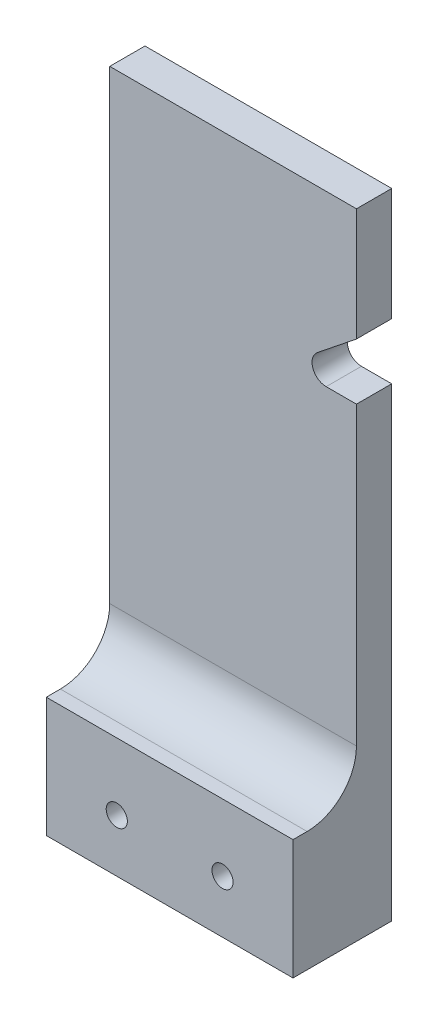
ISO-10303-21;
HEADER;
FILE_DESCRIPTION(('STEP AP214'),'2;1');
FILE_NAME('part.step','',(''),(''),'','','');
FILE_SCHEMA(('AUTOMOTIVE_DESIGN { 1 0 10303 214 1 1 1 1 }'));
ENDSEC;
DATA;
#1=APPLICATION_CONTEXT('core data for automotive mechanical design processes');
#2=APPLICATION_PROTOCOL_DEFINITION('international standard','automotive_design',2000,#1);
#3=PRODUCT_CONTEXT('',#1,'mechanical');
#4=PRODUCT('Part','Part','',(#3));
#5=PRODUCT_RELATED_PRODUCT_CATEGORY('part','',(#4));
#6=PRODUCT_DEFINITION_FORMATION('','',#4);
#7=PRODUCT_DEFINITION_CONTEXT('part definition',#1,'design');
#8=PRODUCT_DEFINITION('design','',#6,#7);
#9=PRODUCT_DEFINITION_SHAPE('','',#8);
#10=(LENGTH_UNIT() NAMED_UNIT(*) SI_UNIT(.MILLI.,.METRE.));
#11=(NAMED_UNIT(*) PLANE_ANGLE_UNIT() SI_UNIT($,.RADIAN.));
#12=(NAMED_UNIT(*) SI_UNIT($,.STERADIAN.) SOLID_ANGLE_UNIT());
#13=UNCERTAINTY_MEASURE_WITH_UNIT(LENGTH_MEASURE(1.E-05),#10,'distance_accuracy_value','');
#14=(GEOMETRIC_REPRESENTATION_CONTEXT(3) GLOBAL_UNCERTAINTY_ASSIGNED_CONTEXT((#13)) GLOBAL_UNIT_ASSIGNED_CONTEXT((#10,
#11,#12)) REPRESENTATION_CONTEXT('',''));
#15=CARTESIAN_POINT('',(0.,0.,0.));
#16=DIRECTION('',(0.,0.,1.));
#17=DIRECTION('',(1.,0.,0.));
#18=AXIS2_PLACEMENT_3D('',#15,#16,#17);
#19=CARTESIAN_POINT('',(17.5,-45.,5.));
#20=DIRECTION('',(-1.,0.,0.));
#21=DIRECTION('',(0.,0.,1.));
#22=AXIS2_PLACEMENT_3D('',#19,#20,#21);
#23=PLANE('',#22);
#24=DIRECTION('',(0.,1.,0.));
#25=VECTOR('',#24,1.);
#26=CARTESIAN_POINT('',(17.5,-45.,5.));
#27=LINE('',#26,#25);
#28=CARTESIAN_POINT('',(17.5,29.,5.));
#29=VERTEX_POINT('',#28);
#30=CARTESIAN_POINT('',(17.5,45.,5.));
#31=VERTEX_POINT('',#30);
#32=EDGE_CURVE('E138',#29,#31,#27,.T.);
#33=ORIENTED_EDGE('',*,*,#32,.F.);
#34=DIRECTION('',(0.,0.,-1.));
#35=VECTOR('',#34,1.);
#36=CARTESIAN_POINT('',(17.5,29.,14.));
#37=LINE('',#36,#35);
#38=CARTESIAN_POINT('',(17.5,29.,0.));
#39=VERTEX_POINT('',#38);
#40=EDGE_CURVE('E127',#29,#39,#37,.T.);
#41=ORIENTED_EDGE('',*,*,#40,.T.);
#42=DIRECTION('',(0.,1.,0.));
#43=VECTOR('',#42,1.);
#44=CARTESIAN_POINT('',(17.5,-45.,0.));
#45=LINE('',#44,#43);
#46=CARTESIAN_POINT('',(17.5,45.,0.));
#47=VERTEX_POINT('',#46);
#48=EDGE_CURVE('E136',#39,#47,#45,.T.);
#49=ORIENTED_EDGE('',*,*,#48,.T.);
#50=DIRECTION('',(0.,0.,-1.));
#51=VECTOR('',#50,1.);
#52=CARTESIAN_POINT('',(17.5,45.,5.));
#53=LINE('',#52,#51);
#54=EDGE_CURVE('E171',#31,#47,#53,.T.);
#55=ORIENTED_EDGE('',*,*,#54,.F.);
#56=EDGE_LOOP('',(#33,#41,#49,#55));
#57=FACE_BOUND('',#56,.T.);
#58=ADVANCED_FACE('F41',(#57),#23,.F.);
#59=CARTESIAN_POINT('',(0.,0.,5.));
#60=DIRECTION('',(0.,0.,-1.));
#61=DIRECTION('',(-1.,0.,0.));
#62=AXIS2_PLACEMENT_3D('',#59,#60,#61);
#63=PLANE('',#62);
#64=DIRECTION('',(-1.,0.,0.));
#65=VECTOR('',#64,1.);
#66=CARTESIAN_POINT('',(0.,21.,5.));
#67=LINE('',#66,#65);
#68=CARTESIAN_POINT('',(17.5,21.,5.));
#69=VERTEX_POINT('',#68);
#70=CARTESIAN_POINT('',(13.2015621187164,21.,5.));
#71=VERTEX_POINT('',#70);
#72=EDGE_CURVE('E238',#69,#71,#67,.T.);
#73=ORIENTED_EDGE('',*,*,#72,.T.);
#74=CARTESIAN_POINT('',(13.2015621187164,23.,5.));
#75=DIRECTION('',(0.,0.,-1.));
#76=DIRECTION('',(-1.,0.,0.));
#77=AXIS2_PLACEMENT_3D('',#74,#75,#76);
#78=CIRCLE('',#77,2.);
#79=CARTESIAN_POINT('',(11.9521720236076,24.561737618886,5.));
#80=VERTEX_POINT('',#79);
#81=EDGE_CURVE('E11',#71,#80,#78,.T.);
#82=ORIENTED_EDGE('',*,*,#81,.T.);
#83=DIRECTION('',(0.78086880944303,0.624695047554424,0.));
#84=VECTOR('',#83,1.);
#85=CARTESIAN_POINT('',(-7.3170731707317,9.14634146341463,5.));
#86=LINE('',#85,#84);
#87=EDGE_CURVE('E229',#80,#29,#86,.T.);
#88=ORIENTED_EDGE('',*,*,#87,.T.);
#89=ORIENTED_EDGE('',*,*,#32,.T.);
#90=DIRECTION('',(-1.,0.,0.));
#91=VECTOR('',#90,1.);
#92=CARTESIAN_POINT('',(-17.5,45.,5.));
#93=LINE('',#92,#91);
#94=CARTESIAN_POINT('',(-17.5,45.,5.));
#95=VERTEX_POINT('',#94);
#96=EDGE_CURVE('E210',#31,#95,#93,.T.);
#97=ORIENTED_EDGE('',*,*,#96,.T.);
#98=DIRECTION('',(0.,-1.,0.));
#99=VECTOR('',#98,1.);
#100=CARTESIAN_POINT('',(-17.5,-45.,5.));
#101=LINE('',#100,#99);
#102=CARTESIAN_POINT('',(-17.5,-21.,5.));
#103=VERTEX_POINT('',#102);
#104=EDGE_CURVE('E155',#95,#103,#101,.T.);
#105=ORIENTED_EDGE('',*,*,#104,.T.);
#106=DIRECTION('',(-1.,0.,0.));
#107=VECTOR('',#106,1.);
#108=CARTESIAN_POINT('',(17.5,-21.,5.));
#109=LINE('',#108,#107);
#110=CARTESIAN_POINT('',(17.5,-21.,5.));
#111=VERTEX_POINT('',#110);
#112=EDGE_CURVE('E176',#103,#111,#109,.F.);
#113=ORIENTED_EDGE('',*,*,#112,.T.);
#114=EDGE_CURVE('E192',#111,#69,#27,.T.);
#115=ORIENTED_EDGE('',*,*,#114,.T.);
#116=EDGE_LOOP('',(#73,#82,#88,#89,#97,#105,#113,#115));
#117=FACE_BOUND('',#116,.T.);
#118=ADVANCED_FACE('F208',(#117),#63,.F.);
#119=CARTESIAN_POINT('',(17.5,-45.,0.));
#120=VERTEX_POINT('',#119);
#121=CARTESIAN_POINT('',(17.5,21.,0.));
#122=VERTEX_POINT('',#121);
#123=EDGE_CURVE('E146',#120,#122,#45,.T.);
#124=ORIENTED_EDGE('',*,*,#123,.T.);
#125=DIRECTION('',(0.,0.,-1.));
#126=VECTOR('',#125,1.);
#127=CARTESIAN_POINT('',(17.5,21.,14.));
#128=LINE('',#127,#126);
#129=EDGE_CURVE('E139',#69,#122,#128,.T.);
#130=ORIENTED_EDGE('',*,*,#129,.F.);
#131=ORIENTED_EDGE('',*,*,#114,.F.);
#132=CARTESIAN_POINT('',(17.5,-21.,12.));
#133=DIRECTION('',(-1.,0.,0.));
#134=DIRECTION('',(0.,0.,1.));
#135=AXIS2_PLACEMENT_3D('',#132,#133,#134);
#136=CIRCLE('',#135,7.);
#137=CARTESIAN_POINT('',(17.5,-28.,12.));
#138=VERTEX_POINT('',#137);
#139=EDGE_CURVE('E180',#111,#138,#136,.T.);
#140=ORIENTED_EDGE('',*,*,#139,.T.);
#141=DIRECTION('',(0.,0.,-1.));
#142=VECTOR('',#141,1.);
#143=CARTESIAN_POINT('',(17.5,-28.,14.));
#144=LINE('',#143,#142);
#145=CARTESIAN_POINT('',(17.5,-28.,14.));
#146=VERTEX_POINT('',#145);
#147=EDGE_CURVE('E147',#146,#138,#144,.T.);
#148=ORIENTED_EDGE('',*,*,#147,.F.);
#149=DIRECTION('',(0.,1.,0.));
#150=VECTOR('',#149,1.);
#151=CARTESIAN_POINT('',(17.5,-45.,14.));
#152=LINE('',#151,#150);
#153=CARTESIAN_POINT('',(17.5,-45.,14.));
#154=VERTEX_POINT('',#153);
#155=EDGE_CURVE('E216',#154,#146,#152,.T.);
#156=ORIENTED_EDGE('',*,*,#155,.F.);
#157=DIRECTION('',(0.,0.,-1.));
#158=VECTOR('',#157,1.);
#159=CARTESIAN_POINT('',(17.5,-45.,5.));
#160=LINE('',#159,#158);
#161=EDGE_CURVE('E162',#154,#120,#160,.T.);
#162=ORIENTED_EDGE('',*,*,#161,.T.);
#163=EDGE_LOOP('',(#124,#130,#131,#140,#148,#156,#162));
#164=FACE_BOUND('',#163,.T.);
#165=ADVANCED_FACE('F187',(#164),#23,.F.);
#166=CARTESIAN_POINT('',(-17.5,45.,5.));
#167=DIRECTION('',(0.,-1.,0.));
#168=DIRECTION('',(0.,0.,-1.));
#169=AXIS2_PLACEMENT_3D('',#166,#167,#168);
#170=PLANE('',#169);
#171=DIRECTION('',(-1.,0.,0.));
#172=VECTOR('',#171,1.);
#173=CARTESIAN_POINT('',(-17.5,45.,0.));
#174=LINE('',#173,#172);
#175=CARTESIAN_POINT('',(-17.5,45.,0.));
#176=VERTEX_POINT('',#175);
#177=EDGE_CURVE('E144',#47,#176,#174,.T.);
#178=ORIENTED_EDGE('',*,*,#177,.T.);
#179=DIRECTION('',(0.,0.,-1.));
#180=VECTOR('',#179,1.);
#181=CARTESIAN_POINT('',(-17.5,45.,5.));
#182=LINE('',#181,#180);
#183=EDGE_CURVE('E168',#95,#176,#182,.T.);
#184=ORIENTED_EDGE('',*,*,#183,.F.);
#185=ORIENTED_EDGE('',*,*,#96,.F.);
#186=ORIENTED_EDGE('',*,*,#54,.T.);
#187=EDGE_LOOP('',(#178,#184,#185,#186));
#188=FACE_BOUND('',#187,.T.);
#189=ADVANCED_FACE('F250',(#188),#170,.F.);
#190=CARTESIAN_POINT('',(-17.5,-45.,5.));
#191=DIRECTION('',(1.,0.,0.));
#192=DIRECTION('',(0.,0.,-1.));
#193=AXIS2_PLACEMENT_3D('',#190,#191,#192);
#194=PLANE('',#193);
#195=DIRECTION('',(0.,-1.,0.));
#196=VECTOR('',#195,1.);
#197=CARTESIAN_POINT('',(-17.5,-45.,0.));
#198=LINE('',#197,#196);
#199=CARTESIAN_POINT('',(-17.5,-45.,0.));
#200=VERTEX_POINT('',#199);
#201=EDGE_CURVE('E158',#176,#200,#198,.T.);
#202=ORIENTED_EDGE('',*,*,#201,.T.);
#203=DIRECTION('',(0.,0.,-1.));
#204=VECTOR('',#203,1.);
#205=CARTESIAN_POINT('',(-17.5,-45.,5.));
#206=LINE('',#205,#204);
#207=CARTESIAN_POINT('',(-17.5,-45.,14.));
#208=VERTEX_POINT('',#207);
#209=EDGE_CURVE('E165',#208,#200,#206,.T.);
#210=ORIENTED_EDGE('',*,*,#209,.F.);
#211=DIRECTION('',(0.,-1.,0.));
#212=VECTOR('',#211,1.);
#213=CARTESIAN_POINT('',(-17.5,-45.,14.));
#214=LINE('',#213,#212);
#215=CARTESIAN_POINT('',(-17.5,-28.,14.));
#216=VERTEX_POINT('',#215);
#217=EDGE_CURVE('E221',#216,#208,#214,.T.);
#218=ORIENTED_EDGE('',*,*,#217,.F.);
#219=DIRECTION('',(0.,0.,-1.));
#220=VECTOR('',#219,1.);
#221=CARTESIAN_POINT('',(-17.5,-28.,14.));
#222=LINE('',#221,#220);
#223=CARTESIAN_POINT('',(-17.5,-28.,12.));
#224=VERTEX_POINT('',#223);
#225=EDGE_CURVE('E151',#216,#224,#222,.T.);
#226=ORIENTED_EDGE('',*,*,#225,.T.);
#227=CARTESIAN_POINT('',(-17.5,-21.,12.));
#228=DIRECTION('',(1.,0.,0.));
#229=DIRECTION('',(0.,0.,-1.));
#230=AXIS2_PLACEMENT_3D('',#227,#228,#229);
#231=CIRCLE('',#230,7.);
#232=EDGE_CURVE('E178',#224,#103,#231,.T.);
#233=ORIENTED_EDGE('',*,*,#232,.T.);
#234=ORIENTED_EDGE('',*,*,#104,.F.);
#235=ORIENTED_EDGE('',*,*,#183,.T.);
#236=EDGE_LOOP('',(#202,#210,#218,#226,#233,#234,#235));
#237=FACE_BOUND('',#236,.T.);
#238=ADVANCED_FACE('F205',(#237),#194,.F.);
#239=CARTESIAN_POINT('',(-17.5,-45.,5.));
#240=DIRECTION('',(0.,1.,0.));
#241=DIRECTION('',(0.,0.,1.));
#242=AXIS2_PLACEMENT_3D('',#239,#240,#241);
#243=PLANE('',#242);
#244=DIRECTION('',(1.,0.,0.));
#245=VECTOR('',#244,1.);
#246=CARTESIAN_POINT('',(-17.5,-45.,0.));
#247=LINE('',#246,#245);
#248=EDGE_CURVE('E160',#200,#120,#247,.T.);
#249=ORIENTED_EDGE('',*,*,#248,.T.);
#250=ORIENTED_EDGE('',*,*,#161,.F.);
#251=DIRECTION('',(1.,0.,0.));
#252=VECTOR('',#251,1.);
#253=CARTESIAN_POINT('',(-17.5,-45.,14.));
#254=LINE('',#253,#252);
#255=EDGE_CURVE('E218',#208,#154,#254,.T.);
#256=ORIENTED_EDGE('',*,*,#255,.F.);
#257=ORIENTED_EDGE('',*,*,#209,.T.);
#258=EDGE_LOOP('',(#249,#250,#256,#257));
#259=FACE_BOUND('',#258,.T.);
#260=ADVANCED_FACE('F247',(#259),#243,.F.);
#261=CARTESIAN_POINT('',(0.,0.,0.));
#262=DIRECTION('',(0.,0.,-1.));
#263=DIRECTION('',(-1.,0.,0.));
#264=AXIS2_PLACEMENT_3D('',#261,#262,#263);
#265=PLANE('',#264);
#266=DIRECTION('',(0.78086880944303,0.624695047554424,0.));
#267=VECTOR('',#266,1.);
#268=CARTESIAN_POINT('',(7.5,21.,0.));
#269=LINE('',#268,#267);
#270=CARTESIAN_POINT('',(11.9521720236076,24.561737618886,0.));
#271=VERTEX_POINT('',#270);
#272=EDGE_CURVE('E123',#271,#39,#269,.T.);
#273=ORIENTED_EDGE('',*,*,#272,.F.);
#274=CARTESIAN_POINT('',(13.2015621187164,23.,0.));
#275=DIRECTION('',(0.,0.,-1.));
#276=DIRECTION('',(-1.,0.,0.));
#277=AXIS2_PLACEMENT_3D('',#274,#275,#276);
#278=CIRCLE('',#277,2.);
#279=CARTESIAN_POINT('',(13.2015621187164,21.,0.));
#280=VERTEX_POINT('',#279);
#281=EDGE_CURVE('E49',#271,#280,#278,.F.);
#282=ORIENTED_EDGE('',*,*,#281,.T.);
#283=DIRECTION('',(-1.,0.,0.));
#284=VECTOR('',#283,1.);
#285=CARTESIAN_POINT('',(17.5,21.,0.));
#286=LINE('',#285,#284);
#287=EDGE_CURVE('E132',#122,#280,#286,.T.);
#288=ORIENTED_EDGE('',*,*,#287,.F.);
#289=ORIENTED_EDGE('',*,*,#123,.F.);
#290=ORIENTED_EDGE('',*,*,#248,.F.);
#291=ORIENTED_EDGE('',*,*,#201,.F.);
#292=ORIENTED_EDGE('',*,*,#177,.F.);
#293=ORIENTED_EDGE('',*,*,#48,.F.);
#294=EDGE_LOOP('',(#273,#282,#288,#289,#290,#291,#292,#293));
#295=FACE_BOUND('',#294,.T.);
#296=CARTESIAN_POINT('',(-7.5,-37.5,0.));
#297=DIRECTION('',(0.,0.,1.));
#298=DIRECTION('',(1.,0.,0.));
#299=AXIS2_PLACEMENT_3D('',#296,#297,#298);
#300=CIRCLE('',#299,1.5);
#301=CARTESIAN_POINT('',(-6.,-37.5,0.));
#302=VERTEX_POINT('',#301);
#303=EDGE_CURVE('E224',#302,#302,#300,.T.);
#304=ORIENTED_EDGE('',*,*,#303,.T.);
#305=EDGE_LOOP('',(#304));
#306=FACE_BOUND('',#305,.T.);
#307=CARTESIAN_POINT('',(7.50000000000001,-37.5,0.));
#308=DIRECTION('',(0.,0.,1.));
#309=DIRECTION('',(1.,0.,0.));
#310=AXIS2_PLACEMENT_3D('',#307,#308,#309);
#311=CIRCLE('',#310,1.5);
#312=CARTESIAN_POINT('',(9.00000000000001,-37.5,0.));
#313=VERTEX_POINT('',#312);
#314=EDGE_CURVE('E225',#313,#313,#311,.T.);
#315=ORIENTED_EDGE('',*,*,#314,.T.);
#316=EDGE_LOOP('',(#315));
#317=FACE_BOUND('',#316,.T.);
#318=ADVANCED_FACE('F141',(#295,#306,#317),#265,.T.);
#319=CARTESIAN_POINT('',(-17.5,-28.,14.));
#320=DIRECTION('',(0.,-1.,0.));
#321=DIRECTION('',(0.,0.,-1.));
#322=AXIS2_PLACEMENT_3D('',#319,#320,#321);
#323=PLANE('',#322);
#324=ORIENTED_EDGE('',*,*,#147,.T.);
#325=DIRECTION('',(-1.,0.,0.));
#326=VECTOR('',#325,1.);
#327=CARTESIAN_POINT('',(-17.5,-28.,12.));
#328=LINE('',#327,#326);
#329=EDGE_CURVE('E173',#138,#224,#328,.T.);
#330=ORIENTED_EDGE('',*,*,#329,.T.);
#331=ORIENTED_EDGE('',*,*,#225,.F.);
#332=DIRECTION('',(-1.,0.,0.));
#333=VECTOR('',#332,1.);
#334=CARTESIAN_POINT('',(-17.5,-28.,14.));
#335=LINE('',#334,#333);
#336=EDGE_CURVE('E200',#146,#216,#335,.T.);
#337=ORIENTED_EDGE('',*,*,#336,.F.);
#338=EDGE_LOOP('',(#324,#330,#331,#337));
#339=FACE_BOUND('',#338,.T.);
#340=ADVANCED_FACE('F197',(#339),#323,.F.);
#341=CARTESIAN_POINT('',(0.,0.,14.));
#342=DIRECTION('',(0.,0.,-1.));
#343=DIRECTION('',(-1.,0.,0.));
#344=AXIS2_PLACEMENT_3D('',#341,#342,#343);
#345=PLANE('',#344);
#346=CARTESIAN_POINT('',(-7.5,-37.5,14.));
#347=DIRECTION('',(0.,0.,1.));
#348=DIRECTION('',(1.,0.,0.));
#349=AXIS2_PLACEMENT_3D('',#346,#347,#348);
#350=CIRCLE('',#349,1.5);
#351=CARTESIAN_POINT('',(-6.,-37.5,14.));
#352=VERTEX_POINT('',#351);
#353=EDGE_CURVE('E232',#352,#352,#350,.T.);
#354=ORIENTED_EDGE('',*,*,#353,.F.);
#355=EDGE_LOOP('',(#354));
#356=FACE_BOUND('',#355,.T.);
#357=CARTESIAN_POINT('',(7.50000000000001,-37.5,14.));
#358=DIRECTION('',(0.,0.,1.));
#359=DIRECTION('',(1.,0.,0.));
#360=AXIS2_PLACEMENT_3D('',#357,#358,#359);
#361=CIRCLE('',#360,1.5);
#362=CARTESIAN_POINT('',(9.00000000000001,-37.5,14.));
#363=VERTEX_POINT('',#362);
#364=EDGE_CURVE('E228',#363,#363,#361,.T.);
#365=ORIENTED_EDGE('',*,*,#364,.F.);
#366=EDGE_LOOP('',(#365));
#367=FACE_BOUND('',#366,.T.);
#368=ORIENTED_EDGE('',*,*,#217,.T.);
#369=ORIENTED_EDGE('',*,*,#255,.T.);
#370=ORIENTED_EDGE('',*,*,#155,.T.);
#371=ORIENTED_EDGE('',*,*,#336,.T.);
#372=EDGE_LOOP('',(#368,#369,#370,#371));
#373=FACE_BOUND('',#372,.T.);
#374=ADVANCED_FACE('F268',(#356,#367,#373),#345,.F.);
#375=CARTESIAN_POINT('',(-17.5,-21.,12.));
#376=DIRECTION('',(1.,0.,0.));
#377=DIRECTION('',(0.,0.,-1.));
#378=AXIS2_PLACEMENT_3D('',#375,#376,#377);
#379=CYLINDRICAL_SURFACE('',#378,7.);
#380=ORIENTED_EDGE('',*,*,#139,.F.);
#381=ORIENTED_EDGE('',*,*,#112,.F.);
#382=ORIENTED_EDGE('',*,*,#232,.F.);
#383=ORIENTED_EDGE('',*,*,#329,.F.);
#384=EDGE_LOOP('',(#380,#381,#382,#383));
#385=FACE_BOUND('',#384,.T.);
#386=ADVANCED_FACE('F201',(#385),#379,.F.);
#387=CARTESIAN_POINT('',(7.50000000000001,-37.5,0.));
#388=DIRECTION('',(0.,0.,1.));
#389=DIRECTION('',(1.,0.,0.));
#390=AXIS2_PLACEMENT_3D('',#387,#388,#389);
#391=CYLINDRICAL_SURFACE('',#390,1.5);
#392=CARTESIAN_POINT('',(9.00000000000001,-37.5,0.));
#393=CARTESIAN_POINT('',(9.00000000000001,-37.5,0.145833333333333));
#394=CARTESIAN_POINT('',(9.00000000000001,-37.5,0.291666666666667));
#395=CARTESIAN_POINT('',(9.00000000000001,-37.5,0.583333333333333));
#396=CARTESIAN_POINT('',(9.00000000000001,-37.5,0.729166666666667));
#397=CARTESIAN_POINT('',(9.00000000000001,-37.5,1.02083333333333));
#398=CARTESIAN_POINT('',(9.00000000000001,-37.5,1.16666666666667));
#399=CARTESIAN_POINT('',(9.00000000000001,-37.5,1.45833333333333));
#400=CARTESIAN_POINT('',(9.00000000000001,-37.5,1.60416666666667));
#401=CARTESIAN_POINT('',(9.00000000000001,-37.5,1.89583333333333));
#402=CARTESIAN_POINT('',(9.00000000000001,-37.5,2.04166666666667));
#403=CARTESIAN_POINT('',(9.00000000000001,-37.5,2.33333333333333));
#404=CARTESIAN_POINT('',(9.00000000000001,-37.5,2.47916666666667));
#405=CARTESIAN_POINT('',(9.00000000000001,-37.5,2.77083333333333));
#406=CARTESIAN_POINT('',(9.00000000000001,-37.5,2.91666666666667));
#407=CARTESIAN_POINT('',(9.00000000000001,-37.5,3.20833333333333));
#408=CARTESIAN_POINT('',(9.00000000000001,-37.5,3.35416666666667));
#409=CARTESIAN_POINT('',(9.00000000000001,-37.5,3.64583333333333));
#410=CARTESIAN_POINT('',(9.00000000000001,-37.5,3.79166666666667));
#411=CARTESIAN_POINT('',(9.00000000000001,-37.5,4.08333333333333));
#412=CARTESIAN_POINT('',(9.00000000000001,-37.5,4.22916666666667));
#413=CARTESIAN_POINT('',(9.00000000000001,-37.5,4.52083333333333));
#414=CARTESIAN_POINT('',(9.00000000000001,-37.5,4.66666666666667));
#415=CARTESIAN_POINT('',(9.00000000000001,-37.5,4.95833333333333));
#416=CARTESIAN_POINT('',(9.00000000000001,-37.5,5.10416666666667));
#417=CARTESIAN_POINT('',(9.00000000000001,-37.5,5.39583333333333));
#418=CARTESIAN_POINT('',(9.00000000000001,-37.5,5.54166666666667));
#419=CARTESIAN_POINT('',(9.00000000000001,-37.5,5.83333333333333));
#420=CARTESIAN_POINT('',(9.00000000000001,-37.5,5.97916666666667));
#421=CARTESIAN_POINT('',(9.00000000000001,-37.5,6.27083333333333));
#422=CARTESIAN_POINT('',(9.00000000000001,-37.5,6.41666666666667));
#423=CARTESIAN_POINT('',(9.00000000000001,-37.5,6.70833333333333));
#424=CARTESIAN_POINT('',(9.00000000000001,-37.5,6.85416666666666));
#425=CARTESIAN_POINT('',(9.00000000000001,-37.5,7.14583333333333));
#426=CARTESIAN_POINT('',(9.00000000000001,-37.5,7.29166666666667));
#427=CARTESIAN_POINT('',(9.00000000000001,-37.5,7.58333333333333));
#428=CARTESIAN_POINT('',(9.00000000000001,-37.5,7.72916666666667));
#429=CARTESIAN_POINT('',(9.00000000000001,-37.5,8.02083333333333));
#430=CARTESIAN_POINT('',(9.00000000000001,-37.5,8.16666666666666));
#431=CARTESIAN_POINT('',(9.00000000000001,-37.5,8.45833333333333));
#432=CARTESIAN_POINT('',(9.00000000000001,-37.5,8.60416666666666));
#433=CARTESIAN_POINT('',(9.00000000000001,-37.5,8.89583333333333));
#434=CARTESIAN_POINT('',(9.00000000000001,-37.5,9.04166666666666));
#435=CARTESIAN_POINT('',(9.00000000000001,-37.5,9.33333333333333));
#436=CARTESIAN_POINT('',(9.00000000000001,-37.5,9.47916666666666));
#437=CARTESIAN_POINT('',(9.00000000000001,-37.5,9.77083333333333));
#438=CARTESIAN_POINT('',(9.00000000000001,-37.5,9.91666666666666));
#439=CARTESIAN_POINT('',(9.00000000000001,-37.5,10.2083333333333));
#440=CARTESIAN_POINT('',(9.00000000000001,-37.5,10.3541666666667));
#441=CARTESIAN_POINT('',(9.00000000000001,-37.5,10.6458333333333));
#442=CARTESIAN_POINT('',(9.00000000000001,-37.5,10.7916666666667));
#443=CARTESIAN_POINT('',(9.00000000000001,-37.5,11.0833333333333));
#444=CARTESIAN_POINT('',(9.00000000000001,-37.5,11.2291666666667));
#445=CARTESIAN_POINT('',(9.00000000000001,-37.5,11.5208333333333));
#446=CARTESIAN_POINT('',(9.00000000000001,-37.5,11.6666666666667));
#447=CARTESIAN_POINT('',(9.00000000000001,-37.5,11.9583333333333));
#448=CARTESIAN_POINT('',(9.00000000000001,-37.5,12.1041666666667));
#449=CARTESIAN_POINT('',(9.00000000000001,-37.5,12.3958333333333));
#450=CARTESIAN_POINT('',(9.00000000000001,-37.5,12.5416666666667));
#451=CARTESIAN_POINT('',(9.00000000000001,-37.5,12.8333333333333));
#452=CARTESIAN_POINT('',(9.00000000000001,-37.5,12.9791666666667));
#453=CARTESIAN_POINT('',(9.00000000000001,-37.5,13.2708333333333));
#454=CARTESIAN_POINT('',(9.00000000000001,-37.5,13.4166666666667));
#455=CARTESIAN_POINT('',(9.00000000000001,-37.5,13.7083333333333));
#456=CARTESIAN_POINT('',(9.00000000000001,-37.5,13.8541666666667));
#457=CARTESIAN_POINT('',(9.00000000000001,-37.5,14.));
#458=B_SPLINE_CURVE_WITH_KNOTS('',3,(#392,#393,#394,#395,#396,#397,#398,#399,#400,#401,#402,
#403,#404,#405,#406,#407,#408,#409,#410,#411,#412,#413,#414,#415,#416,#417,#418,#419,#420,#421,
#422,#423,#424,#425,#426,#427,#428,#429,#430,#431,#432,#433,#434,#435,#436,#437,#438,#439,#440,
#441,#442,#443,#444,#445,#446,#447,#448,#449,#450,#451,#452,#453,#454,#455,#456,#457),
.UNSPECIFIED.,.F.,.F.,(4,2,2,2,2,2,2,2,2,2,2,2,2,2,2,2,2,2,2,2,2,2,2,2,2,2,2,2,2,2,2,2,4),(0.,
0.4375,0.875,1.3125,1.75,2.1875,2.625,3.0625,3.5,3.9375,4.375,4.8125,5.25,5.6875,6.125,6.5625,
7.,7.4375,7.875,8.3125,8.75,9.1875,9.625,10.0625,10.5,10.9375,11.375,11.8125,12.25,12.6875,
13.125,13.5625,14.),.UNSPECIFIED.);
#459=EDGE_CURVE('BSEAM267',#313,#363,#458,.T.);
#460=ORIENTED_EDGE('',*,*,#314,.F.);
#461=ORIENTED_EDGE('',*,*,#364,.T.);
#462=ORIENTED_EDGE('',*,*,#459,.T.);
#463=ORIENTED_EDGE('',*,*,#459,.F.);
#464=EDGE_LOOP('',(#460,#462,#461,#463));
#465=FACE_BOUND('',#464,.T.);
#466=ADVANCED_FACE('F267',(#465),#391,.F.);
#467=CARTESIAN_POINT('',(-7.5,-37.5,0.));
#468=DIRECTION('',(0.,0.,1.));
#469=DIRECTION('',(1.,0.,0.));
#470=AXIS2_PLACEMENT_3D('',#467,#468,#469);
#471=CYLINDRICAL_SURFACE('',#470,1.5);
#472=CARTESIAN_POINT('',(-6.,-37.5,0.));
#473=CARTESIAN_POINT('',(-6.,-37.5,0.145833333333333));
#474=CARTESIAN_POINT('',(-6.,-37.5,0.291666666666667));
#475=CARTESIAN_POINT('',(-6.,-37.5,0.583333333333333));
#476=CARTESIAN_POINT('',(-6.,-37.5,0.729166666666667));
#477=CARTESIAN_POINT('',(-6.,-37.5,1.02083333333333));
#478=CARTESIAN_POINT('',(-6.,-37.5,1.16666666666667));
#479=CARTESIAN_POINT('',(-6.,-37.5,1.45833333333333));
#480=CARTESIAN_POINT('',(-6.,-37.5,1.60416666666667));
#481=CARTESIAN_POINT('',(-6.,-37.5,1.89583333333333));
#482=CARTESIAN_POINT('',(-6.,-37.5,2.04166666666667));
#483=CARTESIAN_POINT('',(-6.,-37.5,2.33333333333333));
#484=CARTESIAN_POINT('',(-6.,-37.5,2.47916666666667));
#485=CARTESIAN_POINT('',(-6.,-37.5,2.77083333333333));
#486=CARTESIAN_POINT('',(-6.,-37.5,2.91666666666667));
#487=CARTESIAN_POINT('',(-6.,-37.5,3.20833333333333));
#488=CARTESIAN_POINT('',(-6.,-37.5,3.35416666666667));
#489=CARTESIAN_POINT('',(-6.,-37.5,3.64583333333333));
#490=CARTESIAN_POINT('',(-6.,-37.5,3.79166666666667));
#491=CARTESIAN_POINT('',(-6.,-37.5,4.08333333333333));
#492=CARTESIAN_POINT('',(-6.,-37.5,4.22916666666667));
#493=CARTESIAN_POINT('',(-6.,-37.5,4.52083333333333));
#494=CARTESIAN_POINT('',(-6.,-37.5,4.66666666666667));
#495=CARTESIAN_POINT('',(-6.,-37.5,4.95833333333333));
#496=CARTESIAN_POINT('',(-6.,-37.5,5.10416666666667));
#497=CARTESIAN_POINT('',(-6.,-37.5,5.39583333333333));
#498=CARTESIAN_POINT('',(-6.,-37.5,5.54166666666667));
#499=CARTESIAN_POINT('',(-6.,-37.5,5.83333333333333));
#500=CARTESIAN_POINT('',(-6.,-37.5,5.97916666666667));
#501=CARTESIAN_POINT('',(-6.,-37.5,6.27083333333333));
#502=CARTESIAN_POINT('',(-6.,-37.5,6.41666666666667));
#503=CARTESIAN_POINT('',(-6.,-37.5,6.70833333333333));
#504=CARTESIAN_POINT('',(-6.,-37.5,6.85416666666666));
#505=CARTESIAN_POINT('',(-6.,-37.5,7.14583333333333));
#506=CARTESIAN_POINT('',(-6.,-37.5,7.29166666666667));
#507=CARTESIAN_POINT('',(-6.,-37.5,7.58333333333333));
#508=CARTESIAN_POINT('',(-6.,-37.5,7.72916666666667));
#509=CARTESIAN_POINT('',(-6.,-37.5,8.02083333333333));
#510=CARTESIAN_POINT('',(-6.,-37.5,8.16666666666666));
#511=CARTESIAN_POINT('',(-6.,-37.5,8.45833333333333));
#512=CARTESIAN_POINT('',(-6.,-37.5,8.60416666666666));
#513=CARTESIAN_POINT('',(-6.,-37.5,8.89583333333333));
#514=CARTESIAN_POINT('',(-6.,-37.5,9.04166666666666));
#515=CARTESIAN_POINT('',(-6.,-37.5,9.33333333333333));
#516=CARTESIAN_POINT('',(-6.,-37.5,9.47916666666666));
#517=CARTESIAN_POINT('',(-6.,-37.5,9.77083333333333));
#518=CARTESIAN_POINT('',(-6.,-37.5,9.91666666666666));
#519=CARTESIAN_POINT('',(-6.,-37.5,10.2083333333333));
#520=CARTESIAN_POINT('',(-6.,-37.5,10.3541666666667));
#521=CARTESIAN_POINT('',(-6.,-37.5,10.6458333333333));
#522=CARTESIAN_POINT('',(-6.,-37.5,10.7916666666667));
#523=CARTESIAN_POINT('',(-6.,-37.5,11.0833333333333));
#524=CARTESIAN_POINT('',(-6.,-37.5,11.2291666666667));
#525=CARTESIAN_POINT('',(-6.,-37.5,11.5208333333333));
#526=CARTESIAN_POINT('',(-6.,-37.5,11.6666666666667));
#527=CARTESIAN_POINT('',(-6.,-37.5,11.9583333333333));
#528=CARTESIAN_POINT('',(-6.,-37.5,12.1041666666667));
#529=CARTESIAN_POINT('',(-6.,-37.5,12.3958333333333));
#530=CARTESIAN_POINT('',(-6.,-37.5,12.5416666666667));
#531=CARTESIAN_POINT('',(-6.,-37.5,12.8333333333333));
#532=CARTESIAN_POINT('',(-6.,-37.5,12.9791666666667));
#533=CARTESIAN_POINT('',(-6.,-37.5,13.2708333333333));
#534=CARTESIAN_POINT('',(-6.,-37.5,13.4166666666667));
#535=CARTESIAN_POINT('',(-6.,-37.5,13.7083333333333));
#536=CARTESIAN_POINT('',(-6.,-37.5,13.8541666666667));
#537=CARTESIAN_POINT('',(-6.,-37.5,14.));
#538=B_SPLINE_CURVE_WITH_KNOTS('',3,(#472,#473,#474,#475,#476,#477,#478,#479,#480,#481,#482,
#483,#484,#485,#486,#487,#488,#489,#490,#491,#492,#493,#494,#495,#496,#497,#498,#499,#500,#501,
#502,#503,#504,#505,#506,#507,#508,#509,#510,#511,#512,#513,#514,#515,#516,#517,#518,#519,#520,
#521,#522,#523,#524,#525,#526,#527,#528,#529,#530,#531,#532,#533,#534,#535,#536,#537),
.UNSPECIFIED.,.F.,.F.,(4,2,2,2,2,2,2,2,2,2,2,2,2,2,2,2,2,2,2,2,2,2,2,2,2,2,2,2,2,2,2,2,4),(0.,
0.4375,0.875,1.3125,1.75,2.1875,2.625,3.0625,3.5,3.9375,4.375,4.8125,5.25,5.6875,6.125,6.5625,
7.,7.4375,7.875,8.3125,8.75,9.1875,9.625,10.0625,10.5,10.9375,11.375,11.8125,12.25,12.6875,
13.125,13.5625,14.),.UNSPECIFIED.);
#539=EDGE_CURVE('BSEAM274',#302,#352,#538,.T.);
#540=ORIENTED_EDGE('',*,*,#303,.F.);
#541=ORIENTED_EDGE('',*,*,#353,.T.);
#542=ORIENTED_EDGE('',*,*,#539,.T.);
#543=ORIENTED_EDGE('',*,*,#539,.F.);
#544=EDGE_LOOP('',(#540,#542,#541,#543));
#545=FACE_BOUND('',#544,.T.);
#546=ADVANCED_FACE('F274',(#545),#471,.F.);
#547=CARTESIAN_POINT('',(7.5,21.,14.));
#548=DIRECTION('',(-0.624695047554424,0.78086880944303,0.));
#549=DIRECTION('',(-0.78086880944303,-0.624695047554424,0.));
#550=AXIS2_PLACEMENT_3D('',#547,#548,#549);
#551=PLANE('',#550);
#552=ORIENTED_EDGE('',*,*,#87,.F.);
#553=DIRECTION('',(0.,0.,-1.));
#554=VECTOR('',#553,1.);
#555=CARTESIAN_POINT('',(11.9521720236076,24.561737618886,0.));
#556=LINE('',#555,#554);
#557=EDGE_CURVE('E130',#80,#271,#556,.T.);
#558=ORIENTED_EDGE('',*,*,#557,.T.);
#559=ORIENTED_EDGE('',*,*,#272,.T.);
#560=ORIENTED_EDGE('',*,*,#40,.F.);
#561=EDGE_LOOP('',(#552,#558,#559,#560));
#562=FACE_BOUND('',#561,.T.);
#563=ADVANCED_FACE('F126',(#562),#551,.F.);
#564=CARTESIAN_POINT('',(17.5,21.,14.));
#565=DIRECTION('',(0.,-1.,0.));
#566=DIRECTION('',(0.,0.,-1.));
#567=AXIS2_PLACEMENT_3D('',#564,#565,#566);
#568=PLANE('',#567);
#569=ORIENTED_EDGE('',*,*,#287,.T.);
#570=DIRECTION('',(0.,0.,-1.));
#571=VECTOR('',#570,1.);
#572=CARTESIAN_POINT('',(13.2015621187164,21.,5.00000000000001));
#573=LINE('',#572,#571);
#574=EDGE_CURVE('E56',#280,#71,#573,.F.);
#575=ORIENTED_EDGE('',*,*,#574,.T.);
#576=ORIENTED_EDGE('',*,*,#72,.F.);
#577=ORIENTED_EDGE('',*,*,#129,.T.);
#578=EDGE_LOOP('',(#569,#575,#576,#577));
#579=FACE_BOUND('',#578,.T.);
#580=ADVANCED_FACE('F241',(#579),#568,.F.);
#581=CARTESIAN_POINT('',(13.2015621187164,23.,14.));
#582=DIRECTION('',(0.,0.,1.));
#583=DIRECTION('',(1.,0.,0.));
#584=AXIS2_PLACEMENT_3D('',#581,#582,#583);
#585=CYLINDRICAL_SURFACE('',#584,2.);
#586=ORIENTED_EDGE('',*,*,#81,.F.);
#587=ORIENTED_EDGE('',*,*,#574,.F.);
#588=ORIENTED_EDGE('',*,*,#281,.F.);
#589=ORIENTED_EDGE('',*,*,#557,.F.);
#590=EDGE_LOOP('',(#586,#587,#588,#589));
#591=FACE_BOUND('',#590,.T.);
#592=ADVANCED_FACE('F43',(#591),#585,.F.);
#593=CLOSED_SHELL('',(#58,#118,#165,#189,#238,#260,#318,#340,#374,#386,#466,#546,#563,#580,#592));
#594=MANIFOLD_SOLID_BREP('B2',#593);
#595=ADVANCED_BREP_SHAPE_REPRESENTATION('',(#18,#594),#14);
#596=SHAPE_DEFINITION_REPRESENTATION(#9,#595);
ENDSEC;
END-ISO-10303-21;
